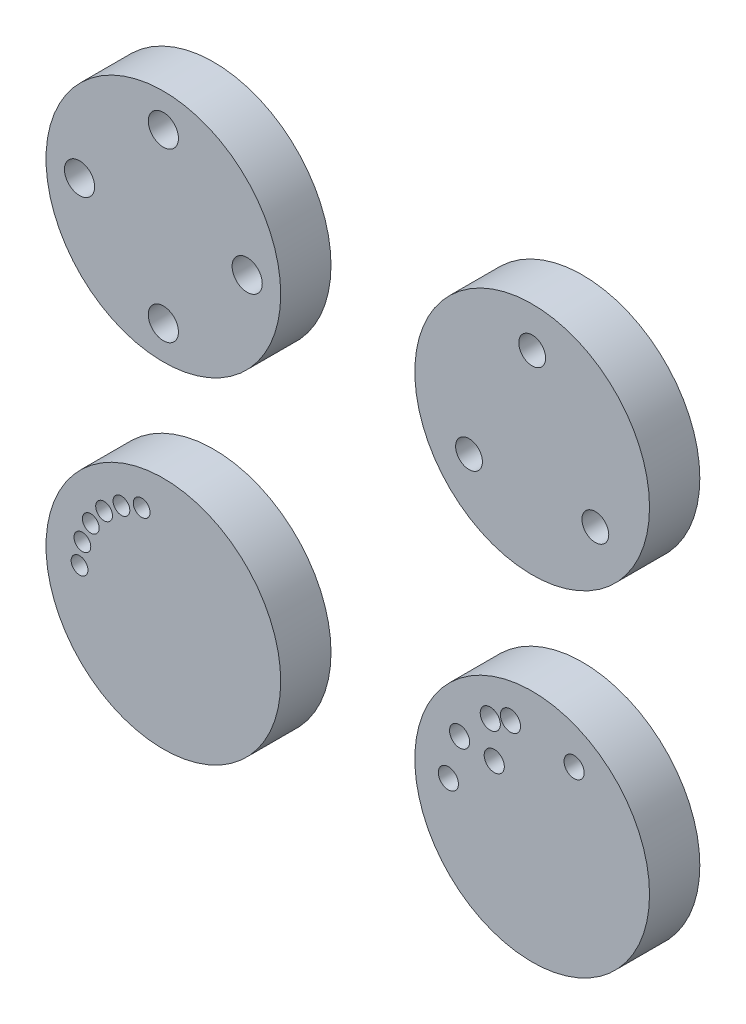
ISO-10303-21;
HEADER;
FILE_DESCRIPTION(('STEP AP214'),'2;1');
FILE_NAME('part.step','',(''),(''),'','','');
FILE_SCHEMA(('AUTOMOTIVE_DESIGN { 1 0 10303 214 1 1 1 1 }'));
ENDSEC;
DATA;
#1=APPLICATION_CONTEXT('core data for automotive mechanical design processes');
#2=APPLICATION_PROTOCOL_DEFINITION('international standard','automotive_design',2000,#1);
#3=PRODUCT_CONTEXT('',#1,'mechanical');
#4=PRODUCT('Part','Part','',(#3));
#5=PRODUCT_RELATED_PRODUCT_CATEGORY('part','',(#4));
#6=PRODUCT_DEFINITION_FORMATION('','',#4);
#7=PRODUCT_DEFINITION_CONTEXT('part definition',#1,'design');
#8=PRODUCT_DEFINITION('design','',#6,#7);
#9=PRODUCT_DEFINITION_SHAPE('','',#8);
#10=(LENGTH_UNIT() NAMED_UNIT(*) SI_UNIT(.MILLI.,.METRE.));
#11=(NAMED_UNIT(*) PLANE_ANGLE_UNIT() SI_UNIT($,.RADIAN.));
#12=(NAMED_UNIT(*) SI_UNIT($,.STERADIAN.) SOLID_ANGLE_UNIT());
#13=UNCERTAINTY_MEASURE_WITH_UNIT(LENGTH_MEASURE(1.E-05),#10,'distance_accuracy_value','');
#14=(GEOMETRIC_REPRESENTATION_CONTEXT(3) GLOBAL_UNCERTAINTY_ASSIGNED_CONTEXT((#13)) GLOBAL_UNIT_ASSIGNED_CONTEXT((#10,
#11,#12)) REPRESENTATION_CONTEXT('',''));
#15=CARTESIAN_POINT('',(0.,0.,0.));
#16=DIRECTION('',(0.,0.,1.));
#17=DIRECTION('',(1.,0.,0.));
#18=AXIS2_PLACEMENT_3D('',#15,#16,#17);
#19=CARTESIAN_POINT('',(110.,-100.,15.));
#20=DIRECTION('',(0.,0.,-1.));
#21=DIRECTION('',(-1.,0.,0.));
#22=AXIS2_PLACEMENT_3D('',#19,#20,#21);
#23=CYLINDRICAL_SURFACE('',#22,35.);
#24=CARTESIAN_POINT('',(110.,-100.,15.));
#25=DIRECTION('',(0.,0.,1.));
#26=DIRECTION('',(1.,0.,0.));
#27=AXIS2_PLACEMENT_3D('',#24,#25,#26);
#28=CIRCLE('',#27,35.);
#29=CARTESIAN_POINT('',(145.,-100.,15.));
#30=VERTEX_POINT('',#29);
#31=EDGE_CURVE('E12',#30,#30,#28,.T.);
#32=ORIENTED_EDGE('',*,*,#31,.F.);
#33=EDGE_LOOP('',(#32));
#34=FACE_BOUND('',#33,.T.);
#35=CARTESIAN_POINT('',(110.,-100.,0.));
#36=DIRECTION('',(0.,0.,1.));
#37=DIRECTION('',(1.,0.,0.));
#38=AXIS2_PLACEMENT_3D('',#35,#36,#37);
#39=CIRCLE('',#38,35.);
#40=CARTESIAN_POINT('',(145.,-100.,0.));
#41=VERTEX_POINT('',#40);
#42=EDGE_CURVE('E109',#41,#41,#39,.T.);
#43=ORIENTED_EDGE('',*,*,#42,.T.);
#44=EDGE_LOOP('',(#43));
#45=FACE_BOUND('',#44,.T.);
#46=ADVANCED_FACE('F106',(#34,#45),#23,.T.);
#47=CARTESIAN_POINT('',(110.,-100.,15.));
#48=DIRECTION('',(0.,0.,1.));
#49=DIRECTION('',(1.,0.,0.));
#50=AXIS2_PLACEMENT_3D('',#47,#48,#49);
#51=PLANE('',#50);
#52=CARTESIAN_POINT('',(122.5,-78.3493649053891,15.));
#53=DIRECTION('',(0.,0.,1.));
#54=DIRECTION('',(1.,0.,0.));
#55=AXIS2_PLACEMENT_3D('',#52,#53,#54);
#56=CIRCLE('',#55,2.99999999999999);
#57=CARTESIAN_POINT('',(125.5,-78.3493649053891,15.));
#58=VERTEX_POINT('',#57);
#59=EDGE_CURVE('E145',#58,#58,#56,.T.);
#60=ORIENTED_EDGE('',*,*,#59,.F.);
#61=EDGE_LOOP('',(#60));
#62=FACE_BOUND('',#61,.T.);
#63=CARTESIAN_POINT('',(103.529523872437,-75.8518543427733,15.));
#64=DIRECTION('',(0.,0.,1.));
#65=DIRECTION('',(1.,0.,0.));
#66=AXIS2_PLACEMENT_3D('',#63,#64,#65);
#67=CIRCLE('',#66,3.00000000000001);
#68=CARTESIAN_POINT('',(106.529523872437,-75.8518543427733,15.));
#69=VERTEX_POINT('',#68);
#70=EDGE_CURVE('E139',#69,#69,#67,.T.);
#71=ORIENTED_EDGE('',*,*,#70,.F.);
#72=EDGE_LOOP('',(#71));
#73=FACE_BOUND('',#72,.T.);
#74=CARTESIAN_POINT('',(97.5000000000001,-78.349364905389,15.));
#75=DIRECTION('',(0.,0.,1.));
#76=DIRECTION('',(1.,0.,0.));
#77=AXIS2_PLACEMENT_3D('',#74,#75,#76);
#78=CIRCLE('',#77,3.00000000000001);
#79=CARTESIAN_POINT('',(100.5,-78.349364905389,15.));
#80=VERTEX_POINT('',#79);
#81=EDGE_CURVE('E133',#80,#80,#78,.T.);
#82=ORIENTED_EDGE('',*,*,#81,.F.);
#83=EDGE_LOOP('',(#82));
#84=FACE_BOUND('',#83,.T.);
#85=CARTESIAN_POINT('',(85.,-100.,15.));
#86=DIRECTION('',(0.,0.,1.));
#87=DIRECTION('',(1.,0.,0.));
#88=AXIS2_PLACEMENT_3D('',#85,#86,#87);
#89=CIRCLE('',#88,3.00000000000001);
#90=CARTESIAN_POINT('',(88.,-100.,15.));
#91=VERTEX_POINT('',#90);
#92=EDGE_CURVE('E127',#91,#91,#89,.T.);
#93=ORIENTED_EDGE('',*,*,#92,.F.);
#94=EDGE_LOOP('',(#93));
#95=FACE_BOUND('',#94,.T.);
#96=CARTESIAN_POINT('',(88.349364905389,-87.5,15.));
#97=DIRECTION('',(0.,0.,1.));
#98=DIRECTION('',(1.,0.,0.));
#99=AXIS2_PLACEMENT_3D('',#96,#97,#98);
#100=CIRCLE('',#99,3.00000000000001);
#101=CARTESIAN_POINT('',(91.349364905389,-87.5,15.));
#102=VERTEX_POINT('',#101);
#103=EDGE_CURVE('E121',#102,#102,#100,.T.);
#104=ORIENTED_EDGE('',*,*,#103,.F.);
#105=EDGE_LOOP('',(#104));
#106=FACE_BOUND('',#105,.T.);
#107=CARTESIAN_POINT('',(98.6862915010152,-88.6862915010152,15.));
#108=DIRECTION('',(0.,0.,1.));
#109=DIRECTION('',(1.,0.,0.));
#110=AXIS2_PLACEMENT_3D('',#107,#108,#109);
#111=CIRCLE('',#110,3.00000000000003);
#112=CARTESIAN_POINT('',(101.686291501015,-88.6862915010152,15.));
#113=VERTEX_POINT('',#112);
#114=EDGE_CURVE('E118',#113,#113,#111,.T.);
#115=ORIENTED_EDGE('',*,*,#114,.F.);
#116=EDGE_LOOP('',(#115));
#117=FACE_BOUND('',#116,.T.);
#118=ORIENTED_EDGE('',*,*,#31,.T.);
#119=EDGE_LOOP('',(#118));
#120=FACE_BOUND('',#119,.T.);
#121=ADVANCED_FACE('F156',(#62,#73,#84,#95,#106,#117,#120),#51,.T.);
#122=CARTESIAN_POINT('',(110.,-100.,0.));
#123=DIRECTION('',(0.,0.,1.));
#124=DIRECTION('',(1.,0.,0.));
#125=AXIS2_PLACEMENT_3D('',#122,#123,#124);
#126=PLANE('',#125);
#127=ORIENTED_EDGE('',*,*,#42,.F.);
#128=EDGE_LOOP('',(#127));
#129=FACE_BOUND('',#128,.T.);
#130=ADVANCED_FACE('F159',(#129),#126,.F.);
#131=CARTESIAN_POINT('',(98.6862915010152,-88.6862915010152,5.));
#132=DIRECTION('',(0.,0.,1.));
#133=DIRECTION('',(1.,0.,0.));
#134=AXIS2_PLACEMENT_3D('',#131,#132,#133);
#135=CYLINDRICAL_SURFACE('',#134,3.00000000000003);
#136=CARTESIAN_POINT('',(98.6862915010152,-88.6862915010152,5.));
#137=DIRECTION('',(0.,0.,1.));
#138=DIRECTION('',(1.,0.,0.));
#139=AXIS2_PLACEMENT_3D('',#136,#137,#138);
#140=CIRCLE('',#139,3.00000000000003);
#141=CARTESIAN_POINT('',(101.686291501015,-88.6862915010152,5.));
#142=VERTEX_POINT('',#141);
#143=EDGE_CURVE('E116',#142,#142,#140,.T.);
#144=ORIENTED_EDGE('',*,*,#143,.F.);
#145=EDGE_LOOP('',(#144));
#146=FACE_BOUND('',#145,.T.);
#147=ORIENTED_EDGE('',*,*,#114,.T.);
#148=EDGE_LOOP('',(#147));
#149=FACE_BOUND('',#148,.T.);
#150=ADVANCED_FACE('F171',(#146,#149),#135,.F.);
#151=CARTESIAN_POINT('',(0.,0.,5.));
#152=DIRECTION('',(0.,0.,1.));
#153=DIRECTION('',(1.,0.,0.));
#154=AXIS2_PLACEMENT_3D('',#151,#152,#153);
#155=PLANE('',#154);
#156=ORIENTED_EDGE('',*,*,#143,.T.);
#157=EDGE_LOOP('',(#156));
#158=FACE_BOUND('',#157,.T.);
#159=ADVANCED_FACE('F173',(#158),#155,.T.);
#160=CARTESIAN_POINT('',(88.349364905389,-87.5,5.));
#161=DIRECTION('',(0.,0.,1.));
#162=DIRECTION('',(1.,0.,0.));
#163=AXIS2_PLACEMENT_3D('',#160,#161,#162);
#164=CYLINDRICAL_SURFACE('',#163,3.00000000000001);
#165=CARTESIAN_POINT('',(88.349364905389,-87.5,5.));
#166=DIRECTION('',(0.,0.,1.));
#167=DIRECTION('',(1.,0.,0.));
#168=AXIS2_PLACEMENT_3D('',#165,#166,#167);
#169=CIRCLE('',#168,3.00000000000001);
#170=CARTESIAN_POINT('',(91.349364905389,-87.5,5.));
#171=VERTEX_POINT('',#170);
#172=EDGE_CURVE('E124',#171,#171,#169,.T.);
#173=ORIENTED_EDGE('',*,*,#172,.F.);
#174=EDGE_LOOP('',(#173));
#175=FACE_BOUND('',#174,.T.);
#176=ORIENTED_EDGE('',*,*,#103,.T.);
#177=EDGE_LOOP('',(#176));
#178=FACE_BOUND('',#177,.T.);
#179=ADVANCED_FACE('F180',(#175,#178),#164,.F.);
#180=CARTESIAN_POINT('',(0.,0.,5.));
#181=DIRECTION('',(0.,0.,1.));
#182=DIRECTION('',(1.,0.,0.));
#183=AXIS2_PLACEMENT_3D('',#180,#181,#182);
#184=PLANE('',#183);
#185=ORIENTED_EDGE('',*,*,#172,.T.);
#186=EDGE_LOOP('',(#185));
#187=FACE_BOUND('',#186,.T.);
#188=ADVANCED_FACE('F220',(#187),#184,.T.);
#189=CARTESIAN_POINT('',(85.,-100.,5.));
#190=DIRECTION('',(0.,0.,1.));
#191=DIRECTION('',(1.,0.,0.));
#192=AXIS2_PLACEMENT_3D('',#189,#190,#191);
#193=CYLINDRICAL_SURFACE('',#192,3.00000000000001);
#194=CARTESIAN_POINT('',(85.,-100.,5.));
#195=DIRECTION('',(0.,0.,1.));
#196=DIRECTION('',(1.,0.,0.));
#197=AXIS2_PLACEMENT_3D('',#194,#195,#196);
#198=CIRCLE('',#197,3.00000000000001);
#199=CARTESIAN_POINT('',(88.,-100.,5.));
#200=VERTEX_POINT('',#199);
#201=EDGE_CURVE('E130',#200,#200,#198,.T.);
#202=ORIENTED_EDGE('',*,*,#201,.F.);
#203=EDGE_LOOP('',(#202));
#204=FACE_BOUND('',#203,.T.);
#205=ORIENTED_EDGE('',*,*,#92,.T.);
#206=EDGE_LOOP('',(#205));
#207=FACE_BOUND('',#206,.T.);
#208=ADVANCED_FACE('F229',(#204,#207),#193,.F.);
#209=CARTESIAN_POINT('',(0.,0.,5.));
#210=DIRECTION('',(0.,0.,1.));
#211=DIRECTION('',(1.,0.,0.));
#212=AXIS2_PLACEMENT_3D('',#209,#210,#211);
#213=PLANE('',#212);
#214=ORIENTED_EDGE('',*,*,#201,.T.);
#215=EDGE_LOOP('',(#214));
#216=FACE_BOUND('',#215,.T.);
#217=ADVANCED_FACE('F241',(#216),#213,.T.);
#218=CARTESIAN_POINT('',(97.5000000000001,-78.349364905389,5.));
#219=DIRECTION('',(0.,0.,1.));
#220=DIRECTION('',(1.,0.,0.));
#221=AXIS2_PLACEMENT_3D('',#218,#219,#220);
#222=CYLINDRICAL_SURFACE('',#221,3.00000000000001);
#223=CARTESIAN_POINT('',(97.5000000000001,-78.349364905389,5.));
#224=DIRECTION('',(0.,0.,1.));
#225=DIRECTION('',(1.,0.,0.));
#226=AXIS2_PLACEMENT_3D('',#223,#224,#225);
#227=CIRCLE('',#226,3.00000000000001);
#228=CARTESIAN_POINT('',(100.5,-78.349364905389,5.));
#229=VERTEX_POINT('',#228);
#230=EDGE_CURVE('E136',#229,#229,#227,.T.);
#231=ORIENTED_EDGE('',*,*,#230,.F.);
#232=EDGE_LOOP('',(#231));
#233=FACE_BOUND('',#232,.T.);
#234=ORIENTED_EDGE('',*,*,#81,.T.);
#235=EDGE_LOOP('',(#234));
#236=FACE_BOUND('',#235,.T.);
#237=ADVANCED_FACE('F250',(#233,#236),#222,.F.);
#238=CARTESIAN_POINT('',(0.,0.,5.));
#239=DIRECTION('',(0.,0.,1.));
#240=DIRECTION('',(1.,0.,0.));
#241=AXIS2_PLACEMENT_3D('',#238,#239,#240);
#242=PLANE('',#241);
#243=ORIENTED_EDGE('',*,*,#230,.T.);
#244=EDGE_LOOP('',(#243));
#245=FACE_BOUND('',#244,.T.);
#246=ADVANCED_FACE('F262',(#245),#242,.T.);
#247=CARTESIAN_POINT('',(103.529523872437,-75.8518543427733,5.));
#248=DIRECTION('',(0.,0.,1.));
#249=DIRECTION('',(1.,0.,0.));
#250=AXIS2_PLACEMENT_3D('',#247,#248,#249);
#251=CYLINDRICAL_SURFACE('',#250,3.00000000000001);
#252=CARTESIAN_POINT('',(103.529523872437,-75.8518543427733,5.));
#253=DIRECTION('',(0.,0.,1.));
#254=DIRECTION('',(1.,0.,0.));
#255=AXIS2_PLACEMENT_3D('',#252,#253,#254);
#256=CIRCLE('',#255,3.00000000000001);
#257=CARTESIAN_POINT('',(106.529523872437,-75.8518543427733,5.));
#258=VERTEX_POINT('',#257);
#259=EDGE_CURVE('E142',#258,#258,#256,.T.);
#260=ORIENTED_EDGE('',*,*,#259,.F.);
#261=EDGE_LOOP('',(#260));
#262=FACE_BOUND('',#261,.T.);
#263=ORIENTED_EDGE('',*,*,#70,.T.);
#264=EDGE_LOOP('',(#263));
#265=FACE_BOUND('',#264,.T.);
#266=ADVANCED_FACE('F274',(#262,#265),#251,.F.);
#267=CARTESIAN_POINT('',(0.,0.,5.));
#268=DIRECTION('',(0.,0.,1.));
#269=DIRECTION('',(1.,0.,0.));
#270=AXIS2_PLACEMENT_3D('',#267,#268,#269);
#271=PLANE('',#270);
#272=ORIENTED_EDGE('',*,*,#259,.T.);
#273=EDGE_LOOP('',(#272));
#274=FACE_BOUND('',#273,.T.);
#275=ADVANCED_FACE('F286',(#274),#271,.T.);
#276=CARTESIAN_POINT('',(122.5,-78.3493649053891,5.));
#277=DIRECTION('',(0.,0.,1.));
#278=DIRECTION('',(1.,0.,0.));
#279=AXIS2_PLACEMENT_3D('',#276,#277,#278);
#280=CYLINDRICAL_SURFACE('',#279,2.99999999999999);
#281=CARTESIAN_POINT('',(122.5,-78.3493649053891,5.));
#282=DIRECTION('',(0.,0.,1.));
#283=DIRECTION('',(1.,0.,0.));
#284=AXIS2_PLACEMENT_3D('',#281,#282,#283);
#285=CIRCLE('',#284,2.99999999999999);
#286=CARTESIAN_POINT('',(125.5,-78.3493649053891,5.));
#287=VERTEX_POINT('',#286);
#288=EDGE_CURVE('E148',#287,#287,#285,.T.);
#289=ORIENTED_EDGE('',*,*,#288,.F.);
#290=EDGE_LOOP('',(#289));
#291=FACE_BOUND('',#290,.T.);
#292=ORIENTED_EDGE('',*,*,#59,.T.);
#293=EDGE_LOOP('',(#292));
#294=FACE_BOUND('',#293,.T.);
#295=ADVANCED_FACE('F154',(#291,#294),#280,.F.);
#296=CARTESIAN_POINT('',(0.,0.,5.));
#297=DIRECTION('',(0.,0.,1.));
#298=DIRECTION('',(1.,0.,0.));
#299=AXIS2_PLACEMENT_3D('',#296,#297,#298);
#300=PLANE('',#299);
#301=ORIENTED_EDGE('',*,*,#288,.T.);
#302=EDGE_LOOP('',(#301));
#303=FACE_BOUND('',#302,.T.);
#304=ADVANCED_FACE('F306',(#303),#300,.T.);
#305=CLOSED_SHELL('',(#46,#121,#130,#150,#159,#179,#188,#208,#217,#237,#246,#266,#275,#295,#304));
#306=MANIFOLD_SOLID_BREP('B2',#305);
#307=CARTESIAN_POINT('',(0.,-100.,15.));
#308=DIRECTION('',(0.,0.,-1.));
#309=DIRECTION('',(-1.,0.,0.));
#310=AXIS2_PLACEMENT_3D('',#307,#308,#309);
#311=CYLINDRICAL_SURFACE('',#310,35.);
#312=CARTESIAN_POINT('',(0.,-100.,15.));
#313=DIRECTION('',(0.,0.,1.));
#314=DIRECTION('',(1.,0.,0.));
#315=AXIS2_PLACEMENT_3D('',#312,#313,#314);
#316=CIRCLE('',#315,35.);
#317=CARTESIAN_POINT('',(35.,-100.,15.));
#318=VERTEX_POINT('',#317);
#319=EDGE_CURVE('E105',#318,#318,#316,.T.);
#320=ORIENTED_EDGE('',*,*,#319,.F.);
#321=EDGE_LOOP('',(#320));
#322=FACE_BOUND('',#321,.T.);
#323=CARTESIAN_POINT('',(0.,-100.,0.));
#324=DIRECTION('',(0.,0.,1.));
#325=DIRECTION('',(1.,0.,0.));
#326=AXIS2_PLACEMENT_3D('',#323,#324,#325);
#327=CIRCLE('',#326,35.);
#328=CARTESIAN_POINT('',(35.,-100.,0.));
#329=VERTEX_POINT('',#328);
#330=EDGE_CURVE('E358',#329,#329,#327,.T.);
#331=ORIENTED_EDGE('',*,*,#330,.T.);
#332=EDGE_LOOP('',(#331));
#333=FACE_BOUND('',#332,.T.);
#334=ADVANCED_FACE('F355',(#322,#333),#311,.T.);
#335=CARTESIAN_POINT('',(0.,-100.,15.));
#336=DIRECTION('',(0.,0.,1.));
#337=DIRECTION('',(1.,0.,0.));
#338=AXIS2_PLACEMENT_3D('',#335,#336,#337);
#339=PLANE('',#338);
#340=CARTESIAN_POINT('',(-6.47047612756295,-75.8518543427733,15.));
#341=DIRECTION('',(0.,0.,1.));
#342=DIRECTION('',(0.258819045102518,-0.965925826289069,0.));
#343=AXIS2_PLACEMENT_3D('',#340,#341,#342);
#344=CIRCLE('',#343,2.5);
#345=CARTESIAN_POINT('',(-5.82342851480665,-78.266668908496,15.));
#346=VERTEX_POINT('',#345);
#347=EDGE_CURVE('E397',#346,#346,#344,.T.);
#348=ORIENTED_EDGE('',*,*,#347,.F.);
#349=EDGE_LOOP('',(#348));
#350=FACE_BOUND('',#349,.T.);
#351=CARTESIAN_POINT('',(-12.4999999999999,-78.349364905389,15.));
#352=DIRECTION('',(0.,0.,1.));
#353=DIRECTION('',(0.499999999999998,-0.86602540378444,0.));
#354=AXIS2_PLACEMENT_3D('',#351,#352,#353);
#355=CIRCLE('',#354,2.5);
#356=CARTESIAN_POINT('',(-11.2499999999999,-80.5144284148501,15.));
#357=VERTEX_POINT('',#356);
#358=EDGE_CURVE('E391',#357,#357,#355,.T.);
#359=ORIENTED_EDGE('',*,*,#358,.F.);
#360=EDGE_LOOP('',(#359));
#361=FACE_BOUND('',#360,.T.);
#362=CARTESIAN_POINT('',(-17.6776695296637,-82.3223304703363,15.));
#363=DIRECTION('',(0.,0.,1.));
#364=DIRECTION('',(0.707106781186546,-0.707106781186549,0.));
#365=AXIS2_PLACEMENT_3D('',#362,#363,#364);
#366=CIRCLE('',#365,2.5);
#367=CARTESIAN_POINT('',(-15.9099025766973,-84.0900974233027,15.));
#368=VERTEX_POINT('',#367);
#369=EDGE_CURVE('E385',#368,#368,#366,.T.);
#370=ORIENTED_EDGE('',*,*,#369,.F.);
#371=EDGE_LOOP('',(#370));
#372=FACE_BOUND('',#371,.T.);
#373=CARTESIAN_POINT('',(-21.6506350946109,-87.5,15.));
#374=DIRECTION('',(0.,0.,1.));
#375=DIRECTION('',(0.866025403784438,-0.500000000000001,0.));
#376=AXIS2_PLACEMENT_3D('',#373,#374,#375);
#377=CIRCLE('',#376,2.5);
#378=CARTESIAN_POINT('',(-19.4855715851499,-88.75,15.));
#379=VERTEX_POINT('',#378);
#380=EDGE_CURVE('E379',#379,#379,#377,.T.);
#381=ORIENTED_EDGE('',*,*,#380,.F.);
#382=EDGE_LOOP('',(#381));
#383=FACE_BOUND('',#382,.T.);
#384=CARTESIAN_POINT('',(-24.1481456572267,-93.529523872437,15.));
#385=DIRECTION('',(0.,0.,1.));
#386=DIRECTION('',(0.965925826289068,-0.258819045102521,0.));
#387=AXIS2_PLACEMENT_3D('',#384,#385,#386);
#388=CIRCLE('',#387,2.5);
#389=CARTESIAN_POINT('',(-21.733331091504,-94.1765714851933,15.));
#390=VERTEX_POINT('',#389);
#391=EDGE_CURVE('E373',#390,#390,#388,.T.);
#392=ORIENTED_EDGE('',*,*,#391,.F.);
#393=EDGE_LOOP('',(#392));
#394=FACE_BOUND('',#393,.T.);
#395=CARTESIAN_POINT('',(-25.,-100.,15.));
#396=DIRECTION('',(0.,0.,1.));
#397=DIRECTION('',(1.,0.,0.));
#398=AXIS2_PLACEMENT_3D('',#395,#396,#397);
#399=CIRCLE('',#398,2.5);
#400=CARTESIAN_POINT('',(-22.5,-100.,15.));
#401=VERTEX_POINT('',#400);
#402=EDGE_CURVE('E367',#401,#401,#399,.T.);
#403=ORIENTED_EDGE('',*,*,#402,.F.);
#404=EDGE_LOOP('',(#403));
#405=FACE_BOUND('',#404,.T.);
#406=ORIENTED_EDGE('',*,*,#319,.T.);
#407=EDGE_LOOP('',(#406));
#408=FACE_BOUND('',#407,.T.);
#409=ADVANCED_FACE('F419',(#350,#361,#372,#383,#394,#405,#408),#339,.T.);
#410=CARTESIAN_POINT('',(0.,-100.,0.));
#411=DIRECTION('',(0.,0.,1.));
#412=DIRECTION('',(1.,0.,0.));
#413=AXIS2_PLACEMENT_3D('',#410,#411,#412);
#414=PLANE('',#413);
#415=ORIENTED_EDGE('',*,*,#330,.F.);
#416=EDGE_LOOP('',(#415));
#417=FACE_BOUND('',#416,.T.);
#418=ADVANCED_FACE('F424',(#417),#414,.F.);
#419=CARTESIAN_POINT('',(-25.,-100.,5.));
#420=DIRECTION('',(0.,0.,1.));
#421=DIRECTION('',(1.,0.,0.));
#422=AXIS2_PLACEMENT_3D('',#419,#420,#421);
#423=CYLINDRICAL_SURFACE('',#422,2.5);
#424=ORIENTED_EDGE('',*,*,#402,.T.);
#425=EDGE_LOOP('',(#424));
#426=FACE_BOUND('',#425,.T.);
#427=CARTESIAN_POINT('',(-25.,-100.,5.));
#428=DIRECTION('',(0.,0.,1.));
#429=DIRECTION('',(1.,0.,0.));
#430=AXIS2_PLACEMENT_3D('',#427,#428,#429);
#431=CIRCLE('',#430,2.5);
#432=CARTESIAN_POINT('',(-22.5,-100.,5.));
#433=VERTEX_POINT('',#432);
#434=EDGE_CURVE('E365',#433,#433,#431,.T.);
#435=ORIENTED_EDGE('',*,*,#434,.F.);
#436=EDGE_LOOP('',(#435));
#437=FACE_BOUND('',#436,.T.);
#438=ADVANCED_FACE('F431',(#426,#437),#423,.F.);
#439=CARTESIAN_POINT('',(0.,0.,5.));
#440=DIRECTION('',(0.,0.,1.));
#441=DIRECTION('',(1.,0.,0.));
#442=AXIS2_PLACEMENT_3D('',#439,#440,#441);
#443=PLANE('',#442);
#444=ORIENTED_EDGE('',*,*,#434,.T.);
#445=EDGE_LOOP('',(#444));
#446=FACE_BOUND('',#445,.T.);
#447=ADVANCED_FACE('F435',(#446),#443,.T.);
#448=CARTESIAN_POINT('',(-24.1481456572267,-93.529523872437,5.));
#449=DIRECTION('',(0.,0.,1.));
#450=DIRECTION('',(1.,0.,0.));
#451=AXIS2_PLACEMENT_3D('',#448,#449,#450);
#452=CYLINDRICAL_SURFACE('',#451,2.5);
#453=ORIENTED_EDGE('',*,*,#391,.T.);
#454=EDGE_LOOP('',(#453));
#455=FACE_BOUND('',#454,.T.);
#456=CARTESIAN_POINT('',(-24.1481456572267,-93.529523872437,5.));
#457=DIRECTION('',(0.,0.,1.));
#458=DIRECTION('',(0.965925826289068,-0.258819045102521,0.));
#459=AXIS2_PLACEMENT_3D('',#456,#457,#458);
#460=CIRCLE('',#459,2.5);
#461=CARTESIAN_POINT('',(-21.733331091504,-94.1765714851933,5.));
#462=VERTEX_POINT('',#461);
#463=EDGE_CURVE('E370',#462,#462,#460,.T.);
#464=ORIENTED_EDGE('',*,*,#463,.F.);
#465=EDGE_LOOP('',(#464));
#466=FACE_BOUND('',#465,.T.);
#467=ADVANCED_FACE('F441',(#455,#466),#452,.F.);
#468=CARTESIAN_POINT('',(25.8819045102521,-3.40741737109319,5.));
#469=DIRECTION('',(0.,0.,1.));
#470=DIRECTION('',(0.965925826289068,-0.258819045102521,0.));
#471=AXIS2_PLACEMENT_3D('',#468,#469,#470);
#472=PLANE('',#471);
#473=ORIENTED_EDGE('',*,*,#463,.T.);
#474=EDGE_LOOP('',(#473));
#475=FACE_BOUND('',#474,.T.);
#476=ADVANCED_FACE('F445',(#475),#472,.T.);
#477=CARTESIAN_POINT('',(-21.6506350946109,-87.5,5.));
#478=DIRECTION('',(0.,0.,1.));
#479=DIRECTION('',(1.,0.,0.));
#480=AXIS2_PLACEMENT_3D('',#477,#478,#479);
#481=CYLINDRICAL_SURFACE('',#480,2.5);
#482=ORIENTED_EDGE('',*,*,#380,.T.);
#483=EDGE_LOOP('',(#482));
#484=FACE_BOUND('',#483,.T.);
#485=CARTESIAN_POINT('',(-21.6506350946109,-87.5,5.));
#486=DIRECTION('',(0.,0.,1.));
#487=DIRECTION('',(0.866025403784438,-0.500000000000001,0.));
#488=AXIS2_PLACEMENT_3D('',#485,#486,#487);
#489=CIRCLE('',#488,2.5);
#490=CARTESIAN_POINT('',(-19.4855715851499,-88.75,5.));
#491=VERTEX_POINT('',#490);
#492=EDGE_CURVE('E376',#491,#491,#489,.T.);
#493=ORIENTED_EDGE('',*,*,#492,.F.);
#494=EDGE_LOOP('',(#493));
#495=FACE_BOUND('',#494,.T.);
#496=ADVANCED_FACE('F449',(#484,#495),#481,.F.);
#497=CARTESIAN_POINT('',(50.0000000000001,-13.3974596215562,5.));
#498=DIRECTION('',(0.,0.,1.));
#499=DIRECTION('',(0.866025403784438,-0.500000000000001,0.));
#500=AXIS2_PLACEMENT_3D('',#497,#498,#499);
#501=PLANE('',#500);
#502=ORIENTED_EDGE('',*,*,#492,.T.);
#503=EDGE_LOOP('',(#502));
#504=FACE_BOUND('',#503,.T.);
#505=ADVANCED_FACE('F453',(#504),#501,.T.);
#506=CARTESIAN_POINT('',(-17.6776695296637,-82.3223304703363,5.));
#507=DIRECTION('',(0.,0.,1.));
#508=DIRECTION('',(1.,0.,0.));
#509=AXIS2_PLACEMENT_3D('',#506,#507,#508);
#510=CYLINDRICAL_SURFACE('',#509,2.5);
#511=ORIENTED_EDGE('',*,*,#369,.T.);
#512=EDGE_LOOP('',(#511));
#513=FACE_BOUND('',#512,.T.);
#514=CARTESIAN_POINT('',(-17.6776695296637,-82.3223304703363,5.));
#515=DIRECTION('',(0.,0.,1.));
#516=DIRECTION('',(0.707106781186546,-0.707106781186549,0.));
#517=AXIS2_PLACEMENT_3D('',#514,#515,#516);
#518=CIRCLE('',#517,2.5);
#519=CARTESIAN_POINT('',(-15.9099025766973,-84.0900974233027,5.));
#520=VERTEX_POINT('',#519);
#521=EDGE_CURVE('E382',#520,#520,#518,.T.);
#522=ORIENTED_EDGE('',*,*,#521,.F.);
#523=EDGE_LOOP('',(#522));
#524=FACE_BOUND('',#523,.T.);
#525=ADVANCED_FACE('F457',(#513,#524),#510,.F.);
#526=CARTESIAN_POINT('',(70.7106781186549,-29.2893218813454,5.));
#527=DIRECTION('',(0.,0.,1.));
#528=DIRECTION('',(0.707106781186546,-0.707106781186549,0.));
#529=AXIS2_PLACEMENT_3D('',#526,#527,#528);
#530=PLANE('',#529);
#531=ORIENTED_EDGE('',*,*,#521,.T.);
#532=EDGE_LOOP('',(#531));
#533=FACE_BOUND('',#532,.T.);
#534=ADVANCED_FACE('F461',(#533),#530,.T.);
#535=CARTESIAN_POINT('',(-12.4999999999999,-78.349364905389,5.));
#536=DIRECTION('',(0.,0.,1.));
#537=DIRECTION('',(1.,0.,0.));
#538=AXIS2_PLACEMENT_3D('',#535,#536,#537);
#539=CYLINDRICAL_SURFACE('',#538,2.5);
#540=ORIENTED_EDGE('',*,*,#358,.T.);
#541=EDGE_LOOP('',(#540));
#542=FACE_BOUND('',#541,.T.);
#543=CARTESIAN_POINT('',(-12.4999999999999,-78.349364905389,5.));
#544=DIRECTION('',(0.,0.,1.));
#545=DIRECTION('',(0.499999999999998,-0.86602540378444,0.));
#546=AXIS2_PLACEMENT_3D('',#543,#544,#545);
#547=CIRCLE('',#546,2.5);
#548=CARTESIAN_POINT('',(-11.2499999999999,-80.5144284148501,5.));
#549=VERTEX_POINT('',#548);
#550=EDGE_CURVE('E388',#549,#549,#547,.T.);
#551=ORIENTED_EDGE('',*,*,#550,.F.);
#552=EDGE_LOOP('',(#551));
#553=FACE_BOUND('',#552,.T.);
#554=ADVANCED_FACE('F415',(#542,#553),#539,.F.);
#555=CARTESIAN_POINT('',(86.602540378444,-50.0000000000002,5.));
#556=DIRECTION('',(0.,0.,1.));
#557=DIRECTION('',(0.499999999999998,-0.86602540378444,0.));
#558=AXIS2_PLACEMENT_3D('',#555,#556,#557);
#559=PLANE('',#558);
#560=ORIENTED_EDGE('',*,*,#550,.T.);
#561=EDGE_LOOP('',(#560));
#562=FACE_BOUND('',#561,.T.);
#563=ADVANCED_FACE('F407',(#562),#559,.T.);
#564=CARTESIAN_POINT('',(-6.47047612756295,-75.8518543427733,5.));
#565=DIRECTION('',(0.,0.,1.));
#566=DIRECTION('',(1.,0.,0.));
#567=AXIS2_PLACEMENT_3D('',#564,#565,#566);
#568=CYLINDRICAL_SURFACE('',#567,2.5);
#569=ORIENTED_EDGE('',*,*,#347,.T.);
#570=EDGE_LOOP('',(#569));
#571=FACE_BOUND('',#570,.T.);
#572=CARTESIAN_POINT('',(-6.47047612756295,-75.8518543427733,5.));
#573=DIRECTION('',(0.,0.,1.));
#574=DIRECTION('',(0.258819045102518,-0.965925826289069,0.));
#575=AXIS2_PLACEMENT_3D('',#572,#573,#574);
#576=CIRCLE('',#575,2.5);
#577=CARTESIAN_POINT('',(-5.82342851480665,-78.266668908496,5.));
#578=VERTEX_POINT('',#577);
#579=EDGE_CURVE('E394',#578,#578,#576,.T.);
#580=ORIENTED_EDGE('',*,*,#579,.F.);
#581=EDGE_LOOP('',(#580));
#582=FACE_BOUND('',#581,.T.);
#583=ADVANCED_FACE('F405',(#571,#582),#568,.F.);
#584=CARTESIAN_POINT('',(96.5925826289069,-74.1180954897482,5.));
#585=DIRECTION('',(0.,0.,1.));
#586=DIRECTION('',(0.258819045102518,-0.965925826289069,0.));
#587=AXIS2_PLACEMENT_3D('',#584,#585,#586);
#588=PLANE('',#587);
#589=ORIENTED_EDGE('',*,*,#579,.T.);
#590=EDGE_LOOP('',(#589));
#591=FACE_BOUND('',#590,.T.);
#592=ADVANCED_FACE('F403',(#591),#588,.T.);
#593=CLOSED_SHELL('',(#334,#409,#418,#438,#447,#467,#476,#496,#505,#525,#534,#554,#563,#583,#592));
#594=MANIFOLD_SOLID_BREP('B7',#593);
#595=CARTESIAN_POINT('',(110.,0.,15.));
#596=DIRECTION('',(0.,0.,-1.));
#597=DIRECTION('',(-1.,0.,0.));
#598=AXIS2_PLACEMENT_3D('',#595,#596,#597);
#599=CYLINDRICAL_SURFACE('',#598,35.);
#600=CARTESIAN_POINT('',(110.,0.,15.));
#601=DIRECTION('',(0.,0.,1.));
#602=DIRECTION('',(1.,0.,0.));
#603=AXIS2_PLACEMENT_3D('',#600,#601,#602);
#604=CIRCLE('',#603,35.);
#605=CARTESIAN_POINT('',(145.,0.,15.));
#606=VERTEX_POINT('',#605);
#607=EDGE_CURVE('E354',#606,#606,#604,.T.);
#608=ORIENTED_EDGE('',*,*,#607,.F.);
#609=EDGE_LOOP('',(#608));
#610=FACE_BOUND('',#609,.T.);
#611=CARTESIAN_POINT('',(110.,0.,0.));
#612=DIRECTION('',(0.,0.,1.));
#613=DIRECTION('',(1.,0.,0.));
#614=AXIS2_PLACEMENT_3D('',#611,#612,#613);
#615=CIRCLE('',#614,35.);
#616=CARTESIAN_POINT('',(145.,0.,0.));
#617=VERTEX_POINT('',#616);
#618=EDGE_CURVE('E591',#617,#617,#615,.T.);
#619=ORIENTED_EDGE('',*,*,#618,.T.);
#620=EDGE_LOOP('',(#619));
#621=FACE_BOUND('',#620,.T.);
#622=ADVANCED_FACE('F588',(#610,#621),#599,.T.);
#623=CARTESIAN_POINT('',(110.,0.,15.));
#624=DIRECTION('',(0.,0.,1.));
#625=DIRECTION('',(1.,0.,0.));
#626=AXIS2_PLACEMENT_3D('',#623,#624,#625);
#627=PLANE('',#626);
#628=CARTESIAN_POINT('',(128.840497018647,-13.192258036074,15.));
#629=DIRECTION('',(0.,0.,1.));
#630=DIRECTION('',(1.,0.,0.));
#631=AXIS2_PLACEMENT_3D('',#628,#629,#630);
#632=CIRCLE('',#631,3.99999999999999);
#633=CARTESIAN_POINT('',(132.840497018647,-13.192258036074,15.));
#634=VERTEX_POINT('',#633);
#635=EDGE_CURVE('E612',#634,#634,#632,.T.);
#636=ORIENTED_EDGE('',*,*,#635,.F.);
#637=EDGE_LOOP('',(#636));
#638=FACE_BOUND('',#637,.T.);
#639=CARTESIAN_POINT('',(91.1595029813532,-13.192258036074,15.));
#640=DIRECTION('',(0.,0.,1.));
#641=DIRECTION('',(1.,0.,0.));
#642=AXIS2_PLACEMENT_3D('',#639,#640,#641);
#643=CIRCLE('',#642,4.00000000000001);
#644=CARTESIAN_POINT('',(95.1595029813532,-13.192258036074,15.));
#645=VERTEX_POINT('',#644);
#646=EDGE_CURVE('E606',#645,#645,#643,.T.);
#647=ORIENTED_EDGE('',*,*,#646,.F.);
#648=EDGE_LOOP('',(#647));
#649=FACE_BOUND('',#648,.T.);
#650=CARTESIAN_POINT('',(110.,23.,15.));
#651=DIRECTION('',(0.,0.,1.));
#652=DIRECTION('',(1.,0.,0.));
#653=AXIS2_PLACEMENT_3D('',#650,#651,#652);
#654=CIRCLE('',#653,4.00000000000001);
#655=CARTESIAN_POINT('',(114.,23.,15.));
#656=VERTEX_POINT('',#655);
#657=EDGE_CURVE('E600',#656,#656,#654,.T.);
#658=ORIENTED_EDGE('',*,*,#657,.F.);
#659=EDGE_LOOP('',(#658));
#660=FACE_BOUND('',#659,.T.);
#661=ORIENTED_EDGE('',*,*,#607,.T.);
#662=EDGE_LOOP('',(#661));
#663=FACE_BOUND('',#662,.T.);
#664=ADVANCED_FACE('F628',(#638,#649,#660,#663),#627,.T.);
#665=CARTESIAN_POINT('',(110.,0.,0.));
#666=DIRECTION('',(0.,0.,1.));
#667=DIRECTION('',(1.,0.,0.));
#668=AXIS2_PLACEMENT_3D('',#665,#666,#667);
#669=PLANE('',#668);
#670=CARTESIAN_POINT('',(128.840497018647,-13.192258036074,0.));
#671=DIRECTION('',(0.,0.,1.));
#672=DIRECTION('',(1.,0.,0.));
#673=AXIS2_PLACEMENT_3D('',#670,#671,#672);
#674=CIRCLE('',#673,3.99999999999999);
#675=CARTESIAN_POINT('',(132.840497018647,-13.192258036074,0.));
#676=VERTEX_POINT('',#675);
#677=EDGE_CURVE('E609',#676,#676,#674,.T.);
#678=ORIENTED_EDGE('',*,*,#677,.T.);
#679=EDGE_LOOP('',(#678));
#680=FACE_BOUND('',#679,.T.);
#681=CARTESIAN_POINT('',(91.1595029813532,-13.192258036074,0.));
#682=DIRECTION('',(0.,0.,1.));
#683=DIRECTION('',(1.,0.,0.));
#684=AXIS2_PLACEMENT_3D('',#681,#682,#683);
#685=CIRCLE('',#684,4.00000000000001);
#686=CARTESIAN_POINT('',(95.1595029813532,-13.192258036074,0.));
#687=VERTEX_POINT('',#686);
#688=EDGE_CURVE('E603',#687,#687,#685,.T.);
#689=ORIENTED_EDGE('',*,*,#688,.T.);
#690=EDGE_LOOP('',(#689));
#691=FACE_BOUND('',#690,.T.);
#692=CARTESIAN_POINT('',(110.,23.,0.));
#693=DIRECTION('',(0.,0.,1.));
#694=DIRECTION('',(1.,0.,0.));
#695=AXIS2_PLACEMENT_3D('',#692,#693,#694);
#696=CIRCLE('',#695,4.00000000000001);
#697=CARTESIAN_POINT('',(114.,23.,0.));
#698=VERTEX_POINT('',#697);
#699=EDGE_CURVE('E598',#698,#698,#696,.T.);
#700=ORIENTED_EDGE('',*,*,#699,.T.);
#701=EDGE_LOOP('',(#700));
#702=FACE_BOUND('',#701,.T.);
#703=ORIENTED_EDGE('',*,*,#618,.F.);
#704=EDGE_LOOP('',(#703));
#705=FACE_BOUND('',#704,.T.);
#706=ADVANCED_FACE('F618',(#680,#691,#702,#705),#669,.F.);
#707=CARTESIAN_POINT('',(110.,23.,0.));
#708=DIRECTION('',(0.,0.,1.));
#709=DIRECTION('',(1.,0.,0.));
#710=AXIS2_PLACEMENT_3D('',#707,#708,#709);
#711=CYLINDRICAL_SURFACE('',#710,4.00000000000001);
#712=ORIENTED_EDGE('',*,*,#699,.F.);
#713=EDGE_LOOP('',(#712));
#714=FACE_BOUND('',#713,.T.);
#715=ORIENTED_EDGE('',*,*,#657,.T.);
#716=EDGE_LOOP('',(#715));
#717=FACE_BOUND('',#716,.T.);
#718=ADVANCED_FACE('F636',(#714,#717),#711,.F.);
#719=CARTESIAN_POINT('',(91.1595029813532,-13.192258036074,0.));
#720=DIRECTION('',(0.,0.,1.));
#721=DIRECTION('',(1.,0.,0.));
#722=AXIS2_PLACEMENT_3D('',#719,#720,#721);
#723=CYLINDRICAL_SURFACE('',#722,4.00000000000001);
#724=ORIENTED_EDGE('',*,*,#688,.F.);
#725=EDGE_LOOP('',(#724));
#726=FACE_BOUND('',#725,.T.);
#727=ORIENTED_EDGE('',*,*,#646,.T.);
#728=EDGE_LOOP('',(#727));
#729=FACE_BOUND('',#728,.T.);
#730=ADVANCED_FACE('F624',(#726,#729),#723,.F.);
#731=CARTESIAN_POINT('',(128.840497018647,-13.192258036074,0.));
#732=DIRECTION('',(0.,0.,1.));
#733=DIRECTION('',(1.,0.,0.));
#734=AXIS2_PLACEMENT_3D('',#731,#732,#733);
#735=CYLINDRICAL_SURFACE('',#734,3.99999999999999);
#736=ORIENTED_EDGE('',*,*,#677,.F.);
#737=EDGE_LOOP('',(#736));
#738=FACE_BOUND('',#737,.T.);
#739=ORIENTED_EDGE('',*,*,#635,.T.);
#740=EDGE_LOOP('',(#739));
#741=FACE_BOUND('',#740,.T.);
#742=ADVANCED_FACE('F621',(#738,#741),#735,.F.);
#743=CLOSED_SHELL('',(#622,#664,#706,#718,#730,#742));
#744=MANIFOLD_SOLID_BREP('B100',#743);
#745=CARTESIAN_POINT('',(0.,0.,15.));
#746=DIRECTION('',(0.,0.,-1.));
#747=DIRECTION('',(-1.,0.,0.));
#748=AXIS2_PLACEMENT_3D('',#745,#746,#747);
#749=CYLINDRICAL_SURFACE('',#748,35.);
#750=CARTESIAN_POINT('',(0.,0.,15.));
#751=DIRECTION('',(0.,0.,1.));
#752=DIRECTION('',(1.,0.,0.));
#753=AXIS2_PLACEMENT_3D('',#750,#751,#752);
#754=CIRCLE('',#753,35.);
#755=CARTESIAN_POINT('',(35.,0.,15.));
#756=VERTEX_POINT('',#755);
#757=EDGE_CURVE('E587',#756,#756,#754,.T.);
#758=ORIENTED_EDGE('',*,*,#757,.F.);
#759=EDGE_LOOP('',(#758));
#760=FACE_BOUND('',#759,.T.);
#761=CARTESIAN_POINT('',(0.,0.,0.));
#762=DIRECTION('',(0.,0.,1.));
#763=DIRECTION('',(1.,0.,0.));
#764=AXIS2_PLACEMENT_3D('',#761,#762,#763);
#765=CIRCLE('',#764,35.);
#766=CARTESIAN_POINT('',(35.,0.,0.));
#767=VERTEX_POINT('',#766);
#768=EDGE_CURVE('E697',#767,#767,#765,.T.);
#769=ORIENTED_EDGE('',*,*,#768,.T.);
#770=EDGE_LOOP('',(#769));
#771=FACE_BOUND('',#770,.T.);
#772=ADVANCED_FACE('F694',(#760,#771),#749,.T.);
#773=CARTESIAN_POINT('',(0.,0.,15.));
#774=DIRECTION('',(0.,0.,1.));
#775=DIRECTION('',(1.,0.,0.));
#776=AXIS2_PLACEMENT_3D('',#773,#774,#775);
#777=PLANE('',#776);
#778=CARTESIAN_POINT('',(-25.,2.61861100413235E-13,15.));
#779=DIRECTION('',(0.,0.,1.));
#780=DIRECTION('',(0.,1.,0.));
#781=AXIS2_PLACEMENT_3D('',#778,#779,#780);
#782=CIRCLE('',#781,4.5);
#783=CARTESIAN_POINT('',(-25.,4.50000000000026,15.));
#784=VERTEX_POINT('',#783);
#785=EDGE_CURVE('E724',#784,#784,#782,.T.);
#786=ORIENTED_EDGE('',*,*,#785,.F.);
#787=EDGE_LOOP('',(#786));
#788=FACE_BOUND('',#787,.T.);
#789=CARTESIAN_POINT('',(0.,-25.,15.));
#790=DIRECTION('',(0.,0.,1.));
#791=DIRECTION('',(-1.,0.,0.));
#792=AXIS2_PLACEMENT_3D('',#789,#790,#791);
#793=CIRCLE('',#792,4.5);
#794=CARTESIAN_POINT('',(-4.5,-25.,15.));
#795=VERTEX_POINT('',#794);
#796=EDGE_CURVE('E718',#795,#795,#793,.T.);
#797=ORIENTED_EDGE('',*,*,#796,.F.);
#798=EDGE_LOOP('',(#797));
#799=FACE_BOUND('',#798,.T.);
#800=CARTESIAN_POINT('',(25.,0.,15.));
#801=DIRECTION('',(0.,0.,1.));
#802=DIRECTION('',(0.,-1.,0.));
#803=AXIS2_PLACEMENT_3D('',#800,#801,#802);
#804=CIRCLE('',#803,4.5);
#805=CARTESIAN_POINT('',(25.,-4.50000000000009,15.));
#806=VERTEX_POINT('',#805);
#807=EDGE_CURVE('E712',#806,#806,#804,.T.);
#808=ORIENTED_EDGE('',*,*,#807,.F.);
#809=EDGE_LOOP('',(#808));
#810=FACE_BOUND('',#809,.T.);
#811=CARTESIAN_POINT('',(0.,25.,15.));
#812=DIRECTION('',(0.,0.,1.));
#813=DIRECTION('',(1.,0.,0.));
#814=AXIS2_PLACEMENT_3D('',#811,#812,#813);
#815=CIRCLE('',#814,4.5);
#816=CARTESIAN_POINT('',(4.5,25.,15.));
#817=VERTEX_POINT('',#816);
#818=EDGE_CURVE('E706',#817,#817,#815,.T.);
#819=ORIENTED_EDGE('',*,*,#818,.F.);
#820=EDGE_LOOP('',(#819));
#821=FACE_BOUND('',#820,.T.);
#822=ORIENTED_EDGE('',*,*,#757,.T.);
#823=EDGE_LOOP('',(#822));
#824=FACE_BOUND('',#823,.T.);
#825=ADVANCED_FACE('F740',(#788,#799,#810,#821,#824),#777,.T.);
#826=CARTESIAN_POINT('',(0.,0.,0.));
#827=DIRECTION('',(0.,0.,1.));
#828=DIRECTION('',(1.,0.,0.));
#829=AXIS2_PLACEMENT_3D('',#826,#827,#828);
#830=PLANE('',#829);
#831=CARTESIAN_POINT('',(-25.,2.61861100413235E-13,0.));
#832=DIRECTION('',(0.,0.,1.));
#833=DIRECTION('',(0.,1.,0.));
#834=AXIS2_PLACEMENT_3D('',#831,#832,#833);
#835=CIRCLE('',#834,4.5);
#836=CARTESIAN_POINT('',(-25.,4.50000000000026,0.));
#837=VERTEX_POINT('',#836);
#838=EDGE_CURVE('E721',#837,#837,#835,.T.);
#839=ORIENTED_EDGE('',*,*,#838,.T.);
#840=EDGE_LOOP('',(#839));
#841=FACE_BOUND('',#840,.T.);
#842=CARTESIAN_POINT('',(0.,-25.,0.));
#843=DIRECTION('',(0.,0.,1.));
#844=DIRECTION('',(-1.,0.,0.));
#845=AXIS2_PLACEMENT_3D('',#842,#843,#844);
#846=CIRCLE('',#845,4.5);
#847=CARTESIAN_POINT('',(-4.5,-25.,0.));
#848=VERTEX_POINT('',#847);
#849=EDGE_CURVE('E715',#848,#848,#846,.T.);
#850=ORIENTED_EDGE('',*,*,#849,.T.);
#851=EDGE_LOOP('',(#850));
#852=FACE_BOUND('',#851,.T.);
#853=CARTESIAN_POINT('',(25.,0.,0.));
#854=DIRECTION('',(0.,0.,1.));
#855=DIRECTION('',(0.,-1.,0.));
#856=AXIS2_PLACEMENT_3D('',#853,#854,#855);
#857=CIRCLE('',#856,4.5);
#858=CARTESIAN_POINT('',(25.,-4.50000000000009,0.));
#859=VERTEX_POINT('',#858);
#860=EDGE_CURVE('E709',#859,#859,#857,.T.);
#861=ORIENTED_EDGE('',*,*,#860,.T.);
#862=EDGE_LOOP('',(#861));
#863=FACE_BOUND('',#862,.T.);
#864=CARTESIAN_POINT('',(0.,25.,0.));
#865=DIRECTION('',(0.,0.,1.));
#866=DIRECTION('',(1.,0.,0.));
#867=AXIS2_PLACEMENT_3D('',#864,#865,#866);
#868=CIRCLE('',#867,4.5);
#869=CARTESIAN_POINT('',(4.5,25.,0.));
#870=VERTEX_POINT('',#869);
#871=EDGE_CURVE('E704',#870,#870,#868,.T.);
#872=ORIENTED_EDGE('',*,*,#871,.T.);
#873=EDGE_LOOP('',(#872));
#874=FACE_BOUND('',#873,.T.);
#875=ORIENTED_EDGE('',*,*,#768,.F.);
#876=EDGE_LOOP('',(#875));
#877=FACE_BOUND('',#876,.T.);
#878=ADVANCED_FACE('F730',(#841,#852,#863,#874,#877),#830,.F.);
#879=CARTESIAN_POINT('',(0.,25.,0.));
#880=DIRECTION('',(0.,0.,1.));
#881=DIRECTION('',(1.,0.,0.));
#882=AXIS2_PLACEMENT_3D('',#879,#880,#881);
#883=CYLINDRICAL_SURFACE('',#882,4.5);
#884=ORIENTED_EDGE('',*,*,#871,.F.);
#885=EDGE_LOOP('',(#884));
#886=FACE_BOUND('',#885,.T.);
#887=ORIENTED_EDGE('',*,*,#818,.T.);
#888=EDGE_LOOP('',(#887));
#889=FACE_BOUND('',#888,.T.);
#890=ADVANCED_FACE('F750',(#886,#889),#883,.F.);
#891=CARTESIAN_POINT('',(25.,0.,0.));
#892=DIRECTION('',(0.,0.,1.));
#893=DIRECTION('',(1.,0.,0.));
#894=AXIS2_PLACEMENT_3D('',#891,#892,#893);
#895=CYLINDRICAL_SURFACE('',#894,4.5);
#896=ORIENTED_EDGE('',*,*,#860,.F.);
#897=EDGE_LOOP('',(#896));
#898=FACE_BOUND('',#897,.T.);
#899=ORIENTED_EDGE('',*,*,#807,.T.);
#900=EDGE_LOOP('',(#899));
#901=FACE_BOUND('',#900,.T.);
#902=ADVANCED_FACE('F752',(#898,#901),#895,.F.);
#903=CARTESIAN_POINT('',(0.,-25.,0.));
#904=DIRECTION('',(0.,0.,1.));
#905=DIRECTION('',(1.,0.,0.));
#906=AXIS2_PLACEMENT_3D('',#903,#904,#905);
#907=CYLINDRICAL_SURFACE('',#906,4.5);
#908=ORIENTED_EDGE('',*,*,#849,.F.);
#909=EDGE_LOOP('',(#908));
#910=FACE_BOUND('',#909,.T.);
#911=ORIENTED_EDGE('',*,*,#796,.T.);
#912=EDGE_LOOP('',(#911));
#913=FACE_BOUND('',#912,.T.);
#914=ADVANCED_FACE('F736',(#910,#913),#907,.F.);
#915=CARTESIAN_POINT('',(-25.,2.61861100413235E-13,0.));
#916=DIRECTION('',(0.,0.,1.));
#917=DIRECTION('',(1.,0.,0.));
#918=AXIS2_PLACEMENT_3D('',#915,#916,#917);
#919=CYLINDRICAL_SURFACE('',#918,4.5);
#920=ORIENTED_EDGE('',*,*,#838,.F.);
#921=EDGE_LOOP('',(#920));
#922=FACE_BOUND('',#921,.T.);
#923=ORIENTED_EDGE('',*,*,#785,.T.);
#924=EDGE_LOOP('',(#923));
#925=FACE_BOUND('',#924,.T.);
#926=ADVANCED_FACE('F733',(#922,#925),#919,.F.);
#927=CLOSED_SHELL('',(#772,#825,#878,#890,#902,#914,#926));
#928=MANIFOLD_SOLID_BREP('B349',#927);
#929=ADVANCED_BREP_SHAPE_REPRESENTATION('',(#18,#306,#594,#744,#928),#14);
#930=SHAPE_DEFINITION_REPRESENTATION(#9,#929);
ENDSEC;
END-ISO-10303-21;
